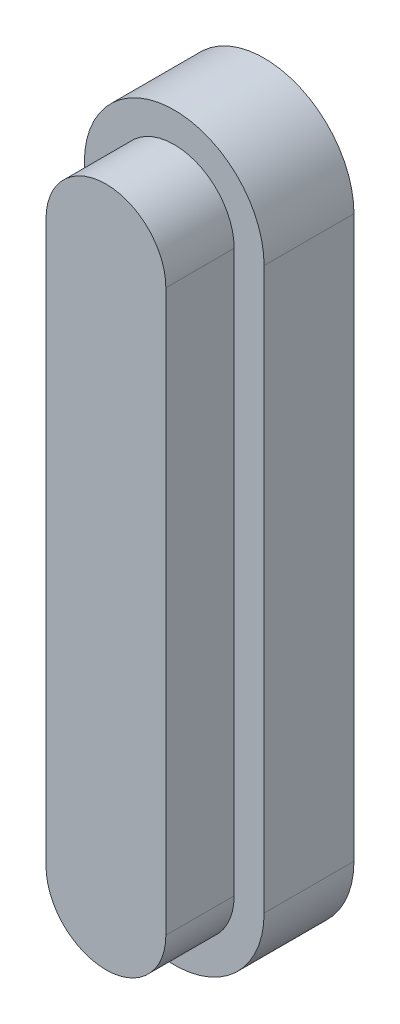
ISO-10303-21;
HEADER;
FILE_DESCRIPTION(('STEP AP214'),'2;1');
FILE_NAME('part.step','',(''),(''),'','','');
FILE_SCHEMA(('AUTOMOTIVE_DESIGN { 1 0 10303 214 1 1 1 1 }'));
ENDSEC;
DATA;
#1=APPLICATION_CONTEXT('core data for automotive mechanical design processes');
#2=APPLICATION_PROTOCOL_DEFINITION('international standard','automotive_design',2000,#1);
#3=PRODUCT_CONTEXT('',#1,'mechanical');
#4=PRODUCT('Part','Part','',(#3));
#5=PRODUCT_RELATED_PRODUCT_CATEGORY('part','',(#4));
#6=PRODUCT_DEFINITION_FORMATION('','',#4);
#7=PRODUCT_DEFINITION_CONTEXT('part definition',#1,'design');
#8=PRODUCT_DEFINITION('design','',#6,#7);
#9=PRODUCT_DEFINITION_SHAPE('','',#8);
#10=(LENGTH_UNIT() NAMED_UNIT(*) SI_UNIT(.MILLI.,.METRE.));
#11=(NAMED_UNIT(*) PLANE_ANGLE_UNIT() SI_UNIT($,.RADIAN.));
#12=(NAMED_UNIT(*) SI_UNIT($,.STERADIAN.) SOLID_ANGLE_UNIT());
#13=UNCERTAINTY_MEASURE_WITH_UNIT(LENGTH_MEASURE(1.E-05),#10,'distance_accuracy_value','');
#14=(GEOMETRIC_REPRESENTATION_CONTEXT(3) GLOBAL_UNCERTAINTY_ASSIGNED_CONTEXT((#13)) GLOBAL_UNIT_ASSIGNED_CONTEXT((#10,
#11,#12)) REPRESENTATION_CONTEXT('',''));
#15=CARTESIAN_POINT('',(0.,0.,0.));
#16=DIRECTION('',(0.,0.,1.));
#17=DIRECTION('',(1.,0.,0.));
#18=AXIS2_PLACEMENT_3D('',#15,#16,#17);
#19=CARTESIAN_POINT('',(0.,-14.859,2.38125));
#20=DIRECTION('',(0.,0.,1.));
#21=DIRECTION('',(1.,0.,0.));
#22=AXIS2_PLACEMENT_3D('',#19,#20,#21);
#23=PLANE('',#22);
#24=CARTESIAN_POINT('',(0.,-14.859,2.38125));
#25=DIRECTION('',(0.,0.,1.));
#26=DIRECTION('',(1.,0.,0.));
#27=AXIS2_PLACEMENT_3D('',#24,#25,#26);
#28=CIRCLE('',#27,2.38125);
#29=CARTESIAN_POINT('',(-2.38125,-14.859,2.38125));
#30=VERTEX_POINT('',#29);
#31=CARTESIAN_POINT('',(2.38125,-14.859,2.38125));
#32=VERTEX_POINT('',#31);
#33=EDGE_CURVE('E164',#30,#32,#28,.T.);
#34=ORIENTED_EDGE('',*,*,#33,.T.);
#35=DIRECTION('',(0.,1.,0.));
#36=VECTOR('',#35,1.);
#37=CARTESIAN_POINT('',(2.38125,-14.859,2.38125));
#38=LINE('',#37,#36);
#39=CARTESIAN_POINT('',(2.38125,0.,2.38125));
#40=VERTEX_POINT('',#39);
#41=EDGE_CURVE('E98',#32,#40,#38,.T.);
#42=ORIENTED_EDGE('',*,*,#41,.T.);
#43=CARTESIAN_POINT('',(0.,0.,2.38125));
#44=DIRECTION('',(0.,0.,1.));
#45=DIRECTION('',(1.,0.,0.));
#46=AXIS2_PLACEMENT_3D('',#43,#44,#45);
#47=CIRCLE('',#46,2.38125);
#48=CARTESIAN_POINT('',(-2.38125,0.,2.38125));
#49=VERTEX_POINT('',#48);
#50=EDGE_CURVE('E169',#40,#49,#47,.T.);
#51=ORIENTED_EDGE('',*,*,#50,.T.);
#52=DIRECTION('',(0.,-1.,0.));
#53=VECTOR('',#52,1.);
#54=CARTESIAN_POINT('',(-2.38125,0.,2.38125));
#55=LINE('',#54,#53);
#56=EDGE_CURVE('E70',#49,#30,#55,.T.);
#57=ORIENTED_EDGE('',*,*,#56,.T.);
#58=EDGE_LOOP('',(#34,#42,#51,#57));
#59=FACE_BOUND('',#58,.T.);
#60=DIRECTION('',(0.,1.,0.));
#61=VECTOR('',#60,1.);
#62=CARTESIAN_POINT('',(1.5875,-14.859,2.38125));
#63=LINE('',#62,#61);
#64=CARTESIAN_POINT('',(1.5875,-14.859,2.38125));
#65=VERTEX_POINT('',#64);
#66=CARTESIAN_POINT('',(1.5875,0.,2.38125));
#67=VERTEX_POINT('',#66);
#68=EDGE_CURVE('E144',#65,#67,#63,.T.);
#69=ORIENTED_EDGE('',*,*,#68,.F.);
#70=CARTESIAN_POINT('',(0.,-14.859,2.38125));
#71=DIRECTION('',(0.,0.,1.));
#72=DIRECTION('',(1.,0.,0.));
#73=AXIS2_PLACEMENT_3D('',#70,#71,#72);
#74=CIRCLE('',#73,1.5875);
#75=CARTESIAN_POINT('',(-1.5875,-14.859,2.38125));
#76=VERTEX_POINT('',#75);
#77=EDGE_CURVE('E146',#76,#65,#74,.T.);
#78=ORIENTED_EDGE('',*,*,#77,.F.);
#79=DIRECTION('',(0.,-1.,0.));
#80=VECTOR('',#79,1.);
#81=CARTESIAN_POINT('',(-1.5875,0.,2.38125));
#82=LINE('',#81,#80);
#83=CARTESIAN_POINT('',(-1.5875,0.,2.38125));
#84=VERTEX_POINT('',#83);
#85=EDGE_CURVE('E61',#84,#76,#82,.T.);
#86=ORIENTED_EDGE('',*,*,#85,.F.);
#87=CARTESIAN_POINT('',(0.,0.,2.38125));
#88=DIRECTION('',(0.,0.,1.));
#89=DIRECTION('',(1.,0.,0.));
#90=AXIS2_PLACEMENT_3D('',#87,#88,#89);
#91=CIRCLE('',#90,1.5875);
#92=EDGE_CURVE('E158',#67,#84,#91,.T.);
#93=ORIENTED_EDGE('',*,*,#92,.F.);
#94=EDGE_LOOP('',(#69,#78,#86,#93));
#95=FACE_BOUND('',#94,.T.);
#96=ADVANCED_FACE('F45',(#59,#95),#23,.T.);
#97=CARTESIAN_POINT('',(0.,-14.859,0.));
#98=DIRECTION('',(0.,0.,1.));
#99=DIRECTION('',(1.,0.,0.));
#100=AXIS2_PLACEMENT_3D('',#97,#98,#99);
#101=PLANE('',#100);
#102=CARTESIAN_POINT('',(0.,-14.859,0.));
#103=DIRECTION('',(0.,0.,1.));
#104=DIRECTION('',(1.,0.,0.));
#105=AXIS2_PLACEMENT_3D('',#102,#103,#104);
#106=CIRCLE('',#105,2.38125);
#107=CARTESIAN_POINT('',(-2.38125,-14.859,0.));
#108=VERTEX_POINT('',#107);
#109=CARTESIAN_POINT('',(2.38125,-14.859,0.));
#110=VERTEX_POINT('',#109);
#111=EDGE_CURVE('E163',#108,#110,#106,.T.);
#112=ORIENTED_EDGE('',*,*,#111,.F.);
#113=DIRECTION('',(0.,-1.,0.));
#114=VECTOR('',#113,1.);
#115=CARTESIAN_POINT('',(-2.38125,0.,0.));
#116=LINE('',#115,#114);
#117=CARTESIAN_POINT('',(-2.38125,0.,0.));
#118=VERTEX_POINT('',#117);
#119=EDGE_CURVE('E91',#118,#108,#116,.T.);
#120=ORIENTED_EDGE('',*,*,#119,.F.);
#121=CARTESIAN_POINT('',(0.,0.,0.));
#122=DIRECTION('',(0.,0.,1.));
#123=DIRECTION('',(1.,0.,0.));
#124=AXIS2_PLACEMENT_3D('',#121,#122,#123);
#125=CIRCLE('',#124,2.38125);
#126=CARTESIAN_POINT('',(2.38125,0.,0.));
#127=VERTEX_POINT('',#126);
#128=EDGE_CURVE('E181',#127,#118,#125,.T.);
#129=ORIENTED_EDGE('',*,*,#128,.F.);
#130=DIRECTION('',(0.,1.,0.));
#131=VECTOR('',#130,1.);
#132=CARTESIAN_POINT('',(2.38125,-14.859,0.));
#133=LINE('',#132,#131);
#134=EDGE_CURVE('E178',#110,#127,#133,.T.);
#135=ORIENTED_EDGE('',*,*,#134,.F.);
#136=EDGE_LOOP('',(#112,#120,#129,#135));
#137=FACE_BOUND('',#136,.T.);
#138=ADVANCED_FACE('F199',(#137),#101,.F.);
#139=CARTESIAN_POINT('',(0.,-14.859,2.38125));
#140=DIRECTION('',(0.,0.,-1.));
#141=DIRECTION('',(-1.,0.,0.));
#142=AXIS2_PLACEMENT_3D('',#139,#140,#141);
#143=CYLINDRICAL_SURFACE('',#142,2.38125);
#144=ORIENTED_EDGE('',*,*,#111,.T.);
#145=DIRECTION('',(0.,0.,-1.));
#146=VECTOR('',#145,1.);
#147=CARTESIAN_POINT('',(2.38125,-14.859,2.38125));
#148=LINE('',#147,#146);
#149=EDGE_CURVE('E11',#32,#110,#148,.T.);
#150=ORIENTED_EDGE('',*,*,#149,.F.);
#151=ORIENTED_EDGE('',*,*,#33,.F.);
#152=DIRECTION('',(0.,0.,-1.));
#153=VECTOR('',#152,1.);
#154=CARTESIAN_POINT('',(-2.38125,-14.859,2.38125));
#155=LINE('',#154,#153);
#156=EDGE_CURVE('E174',#30,#108,#155,.T.);
#157=ORIENTED_EDGE('',*,*,#156,.T.);
#158=EDGE_LOOP('',(#144,#150,#151,#157));
#159=FACE_BOUND('',#158,.T.);
#160=ADVANCED_FACE('F47',(#159),#143,.T.);
#161=CARTESIAN_POINT('',(2.38125,-14.859,2.38125));
#162=DIRECTION('',(-1.,0.,0.));
#163=DIRECTION('',(0.,0.,1.));
#164=AXIS2_PLACEMENT_3D('',#161,#162,#163);
#165=PLANE('',#164);
#166=ORIENTED_EDGE('',*,*,#134,.T.);
#167=DIRECTION('',(0.,0.,-1.));
#168=VECTOR('',#167,1.);
#169=CARTESIAN_POINT('',(2.38125,0.,2.38125));
#170=LINE('',#169,#168);
#171=EDGE_CURVE('E54',#40,#127,#170,.T.);
#172=ORIENTED_EDGE('',*,*,#171,.F.);
#173=ORIENTED_EDGE('',*,*,#41,.F.);
#174=ORIENTED_EDGE('',*,*,#149,.T.);
#175=EDGE_LOOP('',(#166,#172,#173,#174));
#176=FACE_BOUND('',#175,.T.);
#177=ADVANCED_FACE('F212',(#176),#165,.F.);
#178=CARTESIAN_POINT('',(0.,0.,2.38125));
#179=DIRECTION('',(0.,0.,-1.));
#180=DIRECTION('',(-1.,0.,0.));
#181=AXIS2_PLACEMENT_3D('',#178,#179,#180);
#182=CYLINDRICAL_SURFACE('',#181,2.38125);
#183=ORIENTED_EDGE('',*,*,#128,.T.);
#184=DIRECTION('',(0.,0.,-1.));
#185=VECTOR('',#184,1.);
#186=CARTESIAN_POINT('',(-2.38125,0.,2.38125));
#187=LINE('',#186,#185);
#188=EDGE_CURVE('E188',#49,#118,#187,.T.);
#189=ORIENTED_EDGE('',*,*,#188,.F.);
#190=ORIENTED_EDGE('',*,*,#50,.F.);
#191=ORIENTED_EDGE('',*,*,#171,.T.);
#192=EDGE_LOOP('',(#183,#189,#190,#191));
#193=FACE_BOUND('',#192,.T.);
#194=ADVANCED_FACE('F195',(#193),#182,.T.);
#195=CARTESIAN_POINT('',(-2.38125,0.,2.38125));
#196=DIRECTION('',(1.,0.,0.));
#197=DIRECTION('',(0.,1.,0.));
#198=AXIS2_PLACEMENT_3D('',#195,#196,#197);
#199=PLANE('',#198);
#200=ORIENTED_EDGE('',*,*,#119,.T.);
#201=ORIENTED_EDGE('',*,*,#156,.F.);
#202=ORIENTED_EDGE('',*,*,#56,.F.);
#203=ORIENTED_EDGE('',*,*,#188,.T.);
#204=EDGE_LOOP('',(#200,#201,#202,#203));
#205=FACE_BOUND('',#204,.T.);
#206=ADVANCED_FACE('F203',(#205),#199,.F.);
#207=CARTESIAN_POINT('',(1.5875,0.,4.191));
#208=DIRECTION('',(-1.,0.,0.));
#209=DIRECTION('',(0.,0.,1.));
#210=AXIS2_PLACEMENT_3D('',#207,#208,#209);
#211=PLANE('',#210);
#212=ORIENTED_EDGE('',*,*,#68,.T.);
#213=DIRECTION('',(0.,0.,-1.));
#214=VECTOR('',#213,1.);
#215=CARTESIAN_POINT('',(1.5875,0.,4.191));
#216=LINE('',#215,#214);
#217=CARTESIAN_POINT('',(1.5875,0.,4.191));
#218=VERTEX_POINT('',#217);
#219=EDGE_CURVE('E124',#218,#67,#216,.T.);
#220=ORIENTED_EDGE('',*,*,#219,.F.);
#221=DIRECTION('',(0.,1.,0.));
#222=VECTOR('',#221,1.);
#223=CARTESIAN_POINT('',(1.5875,0.,4.191));
#224=LINE('',#223,#222);
#225=CARTESIAN_POINT('',(1.5875,-14.859,4.191));
#226=VERTEX_POINT('',#225);
#227=EDGE_CURVE('E131',#226,#218,#224,.T.);
#228=ORIENTED_EDGE('',*,*,#227,.F.);
#229=DIRECTION('',(0.,0.,-1.));
#230=VECTOR('',#229,1.);
#231=CARTESIAN_POINT('',(1.5875,-14.859,4.191));
#232=LINE('',#231,#230);
#233=EDGE_CURVE('E299',#226,#65,#232,.T.);
#234=ORIENTED_EDGE('',*,*,#233,.T.);
#235=EDGE_LOOP('',(#212,#220,#228,#234));
#236=FACE_BOUND('',#235,.T.);
#237=ADVANCED_FACE('F143',(#236),#211,.F.);
#238=CARTESIAN_POINT('',(0.,0.,4.191));
#239=DIRECTION('',(0.,0.,-1.));
#240=DIRECTION('',(-1.,0.,0.));
#241=AXIS2_PLACEMENT_3D('',#238,#239,#240);
#242=CYLINDRICAL_SURFACE('',#241,1.5875);
#243=ORIENTED_EDGE('',*,*,#92,.T.);
#244=DIRECTION('',(0.,0.,-1.));
#245=VECTOR('',#244,1.);
#246=CARTESIAN_POINT('',(-1.5875,0.,4.191));
#247=LINE('',#246,#245);
#248=CARTESIAN_POINT('',(-1.5875,0.,4.191));
#249=VERTEX_POINT('',#248);
#250=EDGE_CURVE('E126',#249,#84,#247,.T.);
#251=ORIENTED_EDGE('',*,*,#250,.F.);
#252=CARTESIAN_POINT('',(0.,0.,4.191));
#253=DIRECTION('',(0.,0.,1.));
#254=DIRECTION('',(1.,0.,0.));
#255=AXIS2_PLACEMENT_3D('',#252,#253,#254);
#256=CIRCLE('',#255,1.5875);
#257=EDGE_CURVE('E120',#218,#249,#256,.T.);
#258=ORIENTED_EDGE('',*,*,#257,.F.);
#259=ORIENTED_EDGE('',*,*,#219,.T.);
#260=EDGE_LOOP('',(#243,#251,#258,#259));
#261=FACE_BOUND('',#260,.T.);
#262=ADVANCED_FACE('F122',(#261),#242,.T.);
#263=CARTESIAN_POINT('',(-1.5875,0.,4.191));
#264=DIRECTION('',(1.,0.,0.));
#265=DIRECTION('',(0.,1.,0.));
#266=AXIS2_PLACEMENT_3D('',#263,#264,#265);
#267=PLANE('',#266);
#268=ORIENTED_EDGE('',*,*,#85,.T.);
#269=DIRECTION('',(0.,0.,-1.));
#270=VECTOR('',#269,1.);
#271=CARTESIAN_POINT('',(-1.5875,-14.859,4.191));
#272=LINE('',#271,#270);
#273=CARTESIAN_POINT('',(-1.5875,-14.859,4.191));
#274=VERTEX_POINT('',#273);
#275=EDGE_CURVE('E152',#274,#76,#272,.T.);
#276=ORIENTED_EDGE('',*,*,#275,.F.);
#277=DIRECTION('',(0.,-1.,0.));
#278=VECTOR('',#277,1.);
#279=CARTESIAN_POINT('',(-1.5875,0.,4.191));
#280=LINE('',#279,#278);
#281=EDGE_CURVE('E130',#249,#274,#280,.T.);
#282=ORIENTED_EDGE('',*,*,#281,.F.);
#283=ORIENTED_EDGE('',*,*,#250,.T.);
#284=EDGE_LOOP('',(#268,#276,#282,#283));
#285=FACE_BOUND('',#284,.T.);
#286=ADVANCED_FACE('F222',(#285),#267,.F.);
#287=CARTESIAN_POINT('',(0.,-14.859,4.191));
#288=DIRECTION('',(0.,0.,-1.));
#289=DIRECTION('',(-1.,0.,0.));
#290=AXIS2_PLACEMENT_3D('',#287,#288,#289);
#291=CYLINDRICAL_SURFACE('',#290,1.5875);
#292=ORIENTED_EDGE('',*,*,#77,.T.);
#293=ORIENTED_EDGE('',*,*,#233,.F.);
#294=CARTESIAN_POINT('',(0.,-14.859,4.191));
#295=DIRECTION('',(0.,0.,1.));
#296=DIRECTION('',(1.,0.,0.));
#297=AXIS2_PLACEMENT_3D('',#294,#295,#296);
#298=CIRCLE('',#297,1.5875);
#299=EDGE_CURVE('E136',#274,#226,#298,.T.);
#300=ORIENTED_EDGE('',*,*,#299,.F.);
#301=ORIENTED_EDGE('',*,*,#275,.T.);
#302=EDGE_LOOP('',(#292,#293,#300,#301));
#303=FACE_BOUND('',#302,.T.);
#304=ADVANCED_FACE('F225',(#303),#291,.T.);
#305=CARTESIAN_POINT('',(0.,0.,4.191));
#306=DIRECTION('',(0.,0.,1.));
#307=DIRECTION('',(1.,0.,0.));
#308=AXIS2_PLACEMENT_3D('',#305,#306,#307);
#309=PLANE('',#308);
#310=ORIENTED_EDGE('',*,*,#227,.T.);
#311=ORIENTED_EDGE('',*,*,#257,.T.);
#312=ORIENTED_EDGE('',*,*,#281,.T.);
#313=ORIENTED_EDGE('',*,*,#299,.T.);
#314=EDGE_LOOP('',(#310,#311,#312,#313));
#315=FACE_BOUND('',#314,.T.);
#316=ADVANCED_FACE('F134',(#315),#309,.T.);
#317=CLOSED_SHELL('',(#96,#138,#160,#177,#194,#206,#237,#262,#286,#304,#316));
#318=MANIFOLD_SOLID_BREP('B2',#317);
#319=ADVANCED_BREP_SHAPE_REPRESENTATION('',(#18,#318),#14);
#320=SHAPE_DEFINITION_REPRESENTATION(#9,#319);
ENDSEC;
END-ISO-10303-21;
